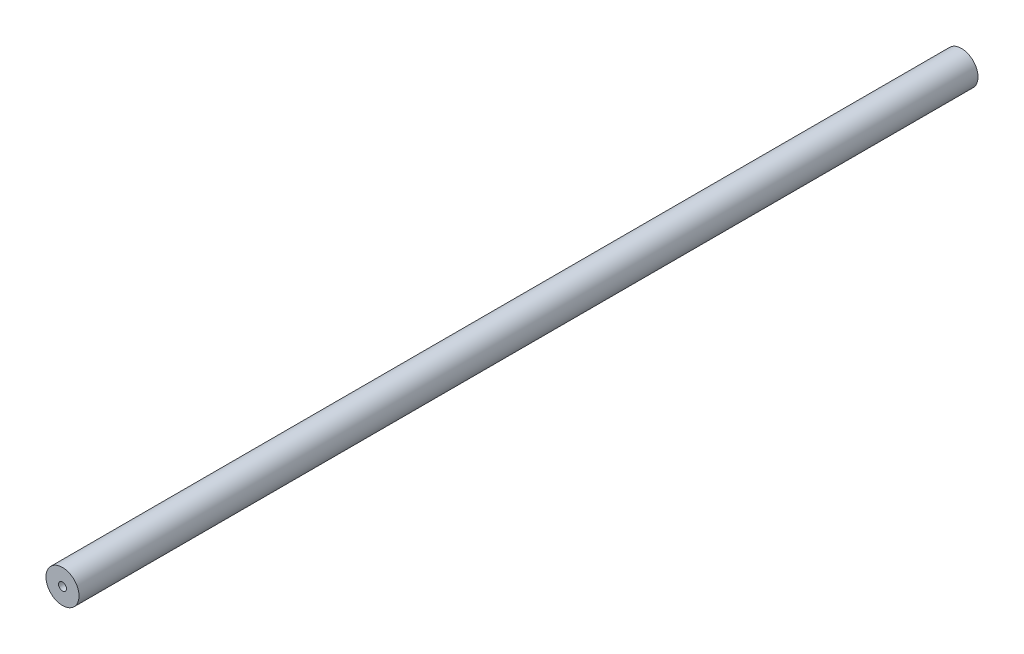
ISO-10303-21;
HEADER;
FILE_DESCRIPTION(('STEP AP214'),'2;1');
FILE_NAME('part.step','',(''),(''),'','','');
FILE_SCHEMA(('AUTOMOTIVE_DESIGN { 1 0 10303 214 1 1 1 1 }'));
ENDSEC;
DATA;
#1=APPLICATION_CONTEXT('core data for automotive mechanical design processes');
#2=APPLICATION_PROTOCOL_DEFINITION('international standard','automotive_design',2000,#1);
#3=PRODUCT_CONTEXT('',#1,'mechanical');
#4=PRODUCT('Part','Part','',(#3));
#5=PRODUCT_RELATED_PRODUCT_CATEGORY('part','',(#4));
#6=PRODUCT_DEFINITION_FORMATION('','',#4);
#7=PRODUCT_DEFINITION_CONTEXT('part definition',#1,'design');
#8=PRODUCT_DEFINITION('design','',#6,#7);
#9=PRODUCT_DEFINITION_SHAPE('','',#8);
#10=(LENGTH_UNIT() NAMED_UNIT(*) SI_UNIT(.MILLI.,.METRE.));
#11=(NAMED_UNIT(*) PLANE_ANGLE_UNIT() SI_UNIT($,.RADIAN.));
#12=(NAMED_UNIT(*) SI_UNIT($,.STERADIAN.) SOLID_ANGLE_UNIT());
#13=UNCERTAINTY_MEASURE_WITH_UNIT(LENGTH_MEASURE(1.E-05),#10,'distance_accuracy_value','');
#14=(GEOMETRIC_REPRESENTATION_CONTEXT(3) GLOBAL_UNCERTAINTY_ASSIGNED_CONTEXT((#13)) GLOBAL_UNIT_ASSIGNED_CONTEXT((#10,
#11,#12)) REPRESENTATION_CONTEXT('',''));
#15=CARTESIAN_POINT('',(0.,0.,0.));
#16=DIRECTION('',(0.,0.,1.));
#17=DIRECTION('',(1.,0.,0.));
#18=AXIS2_PLACEMENT_3D('',#15,#16,#17);
#19=CARTESIAN_POINT('',(0.,0.,680.));
#20=DIRECTION('',(0.,0.,1.));
#21=DIRECTION('',(1.,0.,0.));
#22=AXIS2_PLACEMENT_3D('',#19,#20,#21);
#23=PLANE('',#22);
#24=CARTESIAN_POINT('',(0.,0.,680.));
#25=DIRECTION('',(0.,0.,1.));
#26=DIRECTION('',(1.,0.,0.));
#27=AXIS2_PLACEMENT_3D('',#24,#25,#26);
#28=CIRCLE('',#27,12.5);
#29=CARTESIAN_POINT('',(12.5,0.,680.));
#30=VERTEX_POINT('',#29);
#31=EDGE_CURVE('E10',#30,#30,#28,.T.);
#32=ORIENTED_EDGE('',*,*,#31,.T.);
#33=EDGE_LOOP('',(#32));
#34=FACE_BOUND('',#33,.T.);
#35=CARTESIAN_POINT('',(0.,0.,680.));
#36=DIRECTION('',(0.,0.,1.));
#37=DIRECTION('',(1.,0.,0.));
#38=AXIS2_PLACEMENT_3D('',#35,#36,#37);
#39=CIRCLE('',#38,3.);
#40=CARTESIAN_POINT('',(3.,0.,680.));
#41=VERTEX_POINT('',#40);
#42=EDGE_CURVE('E50',#41,#41,#39,.T.);
#43=ORIENTED_EDGE('',*,*,#42,.F.);
#44=EDGE_LOOP('',(#43));
#45=FACE_BOUND('',#44,.T.);
#46=ADVANCED_FACE('F37',(#34,#45),#23,.T.);
#47=CARTESIAN_POINT('',(0.,0.,0.));
#48=DIRECTION('',(0.,0.,1.));
#49=DIRECTION('',(1.,0.,0.));
#50=AXIS2_PLACEMENT_3D('',#47,#48,#49);
#51=PLANE('',#50);
#52=CARTESIAN_POINT('',(0.,0.,0.));
#53=DIRECTION('',(0.,0.,1.));
#54=DIRECTION('',(1.,0.,0.));
#55=AXIS2_PLACEMENT_3D('',#52,#53,#54);
#56=CIRCLE('',#55,12.5);
#57=CARTESIAN_POINT('',(12.5,0.,0.));
#58=VERTEX_POINT('',#57);
#59=EDGE_CURVE('E41',#58,#58,#56,.T.);
#60=ORIENTED_EDGE('',*,*,#59,.F.);
#61=EDGE_LOOP('',(#60));
#62=FACE_BOUND('',#61,.T.);
#63=CARTESIAN_POINT('',(0.,0.,0.));
#64=DIRECTION('',(0.,0.,1.));
#65=DIRECTION('',(1.,0.,0.));
#66=AXIS2_PLACEMENT_3D('',#63,#64,#65);
#67=CIRCLE('',#66,3.);
#68=CARTESIAN_POINT('',(3.,0.,0.));
#69=VERTEX_POINT('',#68);
#70=EDGE_CURVE('E52',#69,#69,#67,.T.);
#71=ORIENTED_EDGE('',*,*,#70,.T.);
#72=EDGE_LOOP('',(#71));
#73=FACE_BOUND('',#72,.T.);
#74=ADVANCED_FACE('F64',(#62,#73),#51,.F.);
#75=CARTESIAN_POINT('',(0.,0.,680.));
#76=DIRECTION('',(0.,0.,-1.));
#77=DIRECTION('',(-1.,0.,0.));
#78=AXIS2_PLACEMENT_3D('',#75,#76,#77);
#79=CYLINDRICAL_SURFACE('',#78,12.5);
#80=ORIENTED_EDGE('',*,*,#31,.F.);
#81=EDGE_LOOP('',(#80));
#82=FACE_BOUND('',#81,.T.);
#83=ORIENTED_EDGE('',*,*,#59,.T.);
#84=EDGE_LOOP('',(#83));
#85=FACE_BOUND('',#84,.T.);
#86=ADVANCED_FACE('F39',(#82,#85),#79,.T.);
#87=CARTESIAN_POINT('',(0.,0.,680.));
#88=DIRECTION('',(0.,0.,-1.));
#89=DIRECTION('',(-1.,0.,0.));
#90=AXIS2_PLACEMENT_3D('',#87,#88,#89);
#91=CYLINDRICAL_SURFACE('',#90,3.);
#92=ORIENTED_EDGE('',*,*,#42,.T.);
#93=EDGE_LOOP('',(#92));
#94=FACE_BOUND('',#93,.T.);
#95=ORIENTED_EDGE('',*,*,#70,.F.);
#96=EDGE_LOOP('',(#95));
#97=FACE_BOUND('',#96,.T.);
#98=ADVANCED_FACE('F60',(#94,#97),#91,.F.);
#99=CLOSED_SHELL('',(#46,#74,#86,#98));
#100=MANIFOLD_SOLID_BREP('B2',#99);
#101=ADVANCED_BREP_SHAPE_REPRESENTATION('',(#18,#100),#14);
#102=SHAPE_DEFINITION_REPRESENTATION(#9,#101);
ENDSEC;
END-ISO-10303-21;
